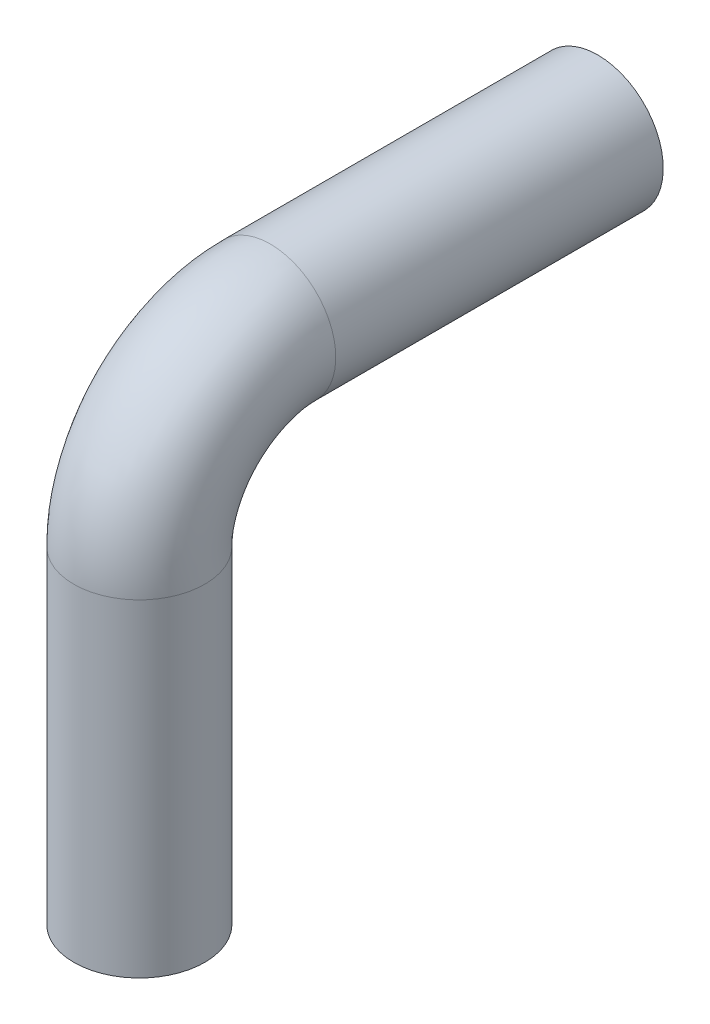
ISO-10303-21;
HEADER;
FILE_DESCRIPTION(('STEP AP214'),'2;1');
FILE_NAME('part.step','',(''),(''),'','','');
FILE_SCHEMA(('AUTOMOTIVE_DESIGN { 1 0 10303 214 1 1 1 1 }'));
ENDSEC;
DATA;
#1=APPLICATION_CONTEXT('core data for automotive mechanical design processes');
#2=APPLICATION_PROTOCOL_DEFINITION('international standard','automotive_design',2000,#1);
#3=PRODUCT_CONTEXT('',#1,'mechanical');
#4=PRODUCT('Part','Part','',(#3));
#5=PRODUCT_RELATED_PRODUCT_CATEGORY('part','',(#4));
#6=PRODUCT_DEFINITION_FORMATION('','',#4);
#7=PRODUCT_DEFINITION_CONTEXT('part definition',#1,'design');
#8=PRODUCT_DEFINITION('design','',#6,#7);
#9=PRODUCT_DEFINITION_SHAPE('','',#8);
#10=(LENGTH_UNIT() NAMED_UNIT(*) SI_UNIT(.MILLI.,.METRE.));
#11=(NAMED_UNIT(*) PLANE_ANGLE_UNIT() SI_UNIT($,.RADIAN.));
#12=(NAMED_UNIT(*) SI_UNIT($,.STERADIAN.) SOLID_ANGLE_UNIT());
#13=UNCERTAINTY_MEASURE_WITH_UNIT(LENGTH_MEASURE(1.E-05),#10,'distance_accuracy_value','');
#14=(GEOMETRIC_REPRESENTATION_CONTEXT(3) GLOBAL_UNCERTAINTY_ASSIGNED_CONTEXT((#13)) GLOBAL_UNIT_ASSIGNED_CONTEXT((#10,
#11,#12)) REPRESENTATION_CONTEXT('',''));
#15=CARTESIAN_POINT('',(0.,0.,0.));
#16=DIRECTION('',(0.,0.,1.));
#17=DIRECTION('',(1.,0.,0.));
#18=AXIS2_PLACEMENT_3D('',#15,#16,#17);
#19=CARTESIAN_POINT('',(0.,0.,0.));
#20=DIRECTION('',(0.,1.,0.));
#21=DIRECTION('',(0.,0.,1.));
#22=AXIS2_PLACEMENT_3D('',#19,#20,#21);
#23=PLANE('',#22);
#24=CARTESIAN_POINT('',(0.,0.,0.));
#25=DIRECTION('',(0.,1.,0.));
#26=DIRECTION('',(0.,0.,1.));
#27=AXIS2_PLACEMENT_3D('',#24,#25,#26);
#28=CIRCLE('',#27,12.7);
#29=CARTESIAN_POINT('',(0.,0.,12.7));
#30=VERTEX_POINT('',#29);
#31=EDGE_CURVE('E44',#30,#30,#28,.T.);
#32=ORIENTED_EDGE('',*,*,#31,.F.);
#33=EDGE_LOOP('',(#32));
#34=FACE_BOUND('',#33,.T.);
#35=ADVANCED_FACE('F32',(#34),#23,.F.);
#36=CARTESIAN_POINT('',(0.,88.9,-88.9));
#37=DIRECTION('',(0.,0.,-1.));
#38=DIRECTION('',(0.,1.,0.));
#39=AXIS2_PLACEMENT_3D('',#36,#37,#38);
#40=PLANE('',#39);
#41=CARTESIAN_POINT('',(0.,88.9,-88.9));
#42=DIRECTION('',(0.,0.,-1.));
#43=DIRECTION('',(0.,1.,0.));
#44=AXIS2_PLACEMENT_3D('',#41,#42,#43);
#45=CIRCLE('',#44,12.7);
#46=CARTESIAN_POINT('',(0.,101.6,-88.9));
#47=VERTEX_POINT('',#46);
#48=EDGE_CURVE('E11',#47,#47,#45,.T.);
#49=ORIENTED_EDGE('',*,*,#48,.T.);
#50=EDGE_LOOP('',(#49));
#51=FACE_BOUND('',#50,.T.);
#52=ADVANCED_FACE('F47',(#51),#40,.T.);
#53=CARTESIAN_POINT('',(0.,0.,0.));
#54=DIRECTION('',(0.,1.,0.));
#55=DIRECTION('',(0.,0.,1.));
#56=AXIS2_PLACEMENT_3D('',#53,#54,#55);
#57=CYLINDRICAL_SURFACE('',#56,12.7);
#58=CARTESIAN_POINT('',(0.,63.4999999999998,0.));
#59=DIRECTION('',(0.,1.,0.));
#60=DIRECTION('',(0.,0.,1.));
#61=AXIS2_PLACEMENT_3D('',#58,#59,#60);
#62=CIRCLE('',#61,12.7);
#63=CARTESIAN_POINT('',(0.,63.4999999999997,12.7));
#64=VERTEX_POINT('',#63);
#65=EDGE_CURVE('E57',#64,#64,#62,.T.);
#66=ORIENTED_EDGE('',*,*,#65,.F.);
#67=EDGE_LOOP('',(#66));
#68=FACE_BOUND('',#67,.T.);
#69=ORIENTED_EDGE('',*,*,#31,.T.);
#70=EDGE_LOOP('',(#69));
#71=FACE_BOUND('',#70,.T.);
#72=ADVANCED_FACE('F62',(#68,#71),#57,.T.);
#73=CARTESIAN_POINT('',(0.,63.5,-25.4));
#74=DIRECTION('',(-1.,0.,0.));
#75=DIRECTION('',(0.,0.,1.));
#76=AXIS2_PLACEMENT_3D('',#73,#74,#75);
#77=TOROIDAL_SURFACE('',#76,25.4,12.7);
#78=CARTESIAN_POINT('',(0.,88.9,-25.4000000000002));
#79=DIRECTION('',(0.,0.,-1.));
#80=DIRECTION('',(0.,1.,0.));
#81=AXIS2_PLACEMENT_3D('',#78,#79,#80);
#82=CIRCLE('',#81,12.7);
#83=CARTESIAN_POINT('',(0.,101.6,-25.4000000000003));
#84=VERTEX_POINT('',#83);
#85=EDGE_CURVE('E39',#84,#84,#82,.T.);
#86=CARTESIAN_POINT('',(0.,63.5,-25.4));
#87=DIRECTION('',(-1.,0.,0.));
#88=DIRECTION('',(0.,0.,1.));
#89=AXIS2_PLACEMENT_3D('',#86,#87,#88);
#90=CIRCLE('',#89,38.1);
#91=EDGE_CURVE('',#64,#84,#90,.T.);
#92=ORIENTED_EDGE('',*,*,#65,.T.);
#93=ORIENTED_EDGE('',*,*,#85,.F.);
#94=ORIENTED_EDGE('',*,*,#91,.T.);
#95=ORIENTED_EDGE('',*,*,#91,.F.);
#96=EDGE_LOOP('',(#92,#94,#93,#95));
#97=FACE_BOUND('',#96,.T.);
#98=ADVANCED_FACE('F52',(#97),#77,.T.);
#99=CARTESIAN_POINT('',(0.,88.9,-25.4000000000002));
#100=DIRECTION('',(0.,0.,-1.));
#101=DIRECTION('',(-1.,0.,0.));
#102=AXIS2_PLACEMENT_3D('',#99,#100,#101);
#103=CYLINDRICAL_SURFACE('',#102,12.7);
#104=ORIENTED_EDGE('',*,*,#48,.F.);
#105=EDGE_LOOP('',(#104));
#106=FACE_BOUND('',#105,.T.);
#107=ORIENTED_EDGE('',*,*,#85,.T.);
#108=EDGE_LOOP('',(#107));
#109=FACE_BOUND('',#108,.T.);
#110=ADVANCED_FACE('F49',(#106,#109),#103,.T.);
#111=CLOSED_SHELL('',(#35,#52,#72,#98,#110));
#112=MANIFOLD_SOLID_BREP('B2',#111);
#113=ADVANCED_BREP_SHAPE_REPRESENTATION('',(#18,#112),#14);
#114=SHAPE_DEFINITION_REPRESENTATION(#9,#113);
ENDSEC;
END-ISO-10303-21;
